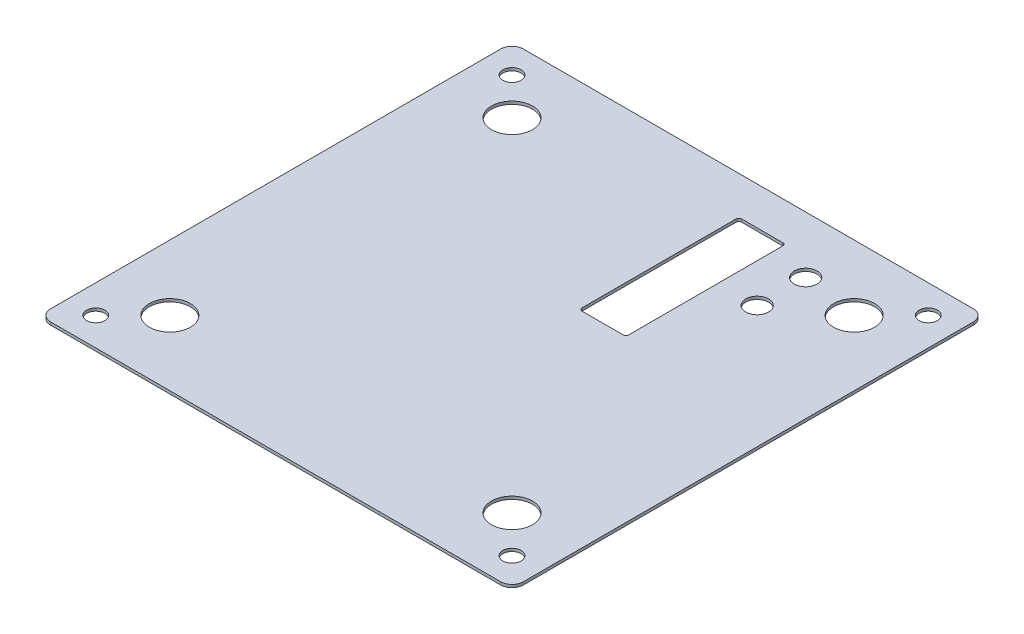
ISO-10303-21;
HEADER;
FILE_DESCRIPTION(('STEP AP214'),'2;1');
FILE_NAME('part.step','',(''),(''),'','','');
FILE_SCHEMA(('AUTOMOTIVE_DESIGN { 1 0 10303 214 1 1 1 1 }'));
ENDSEC;
DATA;
#1=APPLICATION_CONTEXT('core data for automotive mechanical design processes');
#2=APPLICATION_PROTOCOL_DEFINITION('international standard','automotive_design',2000,#1);
#3=PRODUCT_CONTEXT('',#1,'mechanical');
#4=PRODUCT('Part','Part','',(#3));
#5=PRODUCT_RELATED_PRODUCT_CATEGORY('part','',(#4));
#6=PRODUCT_DEFINITION_FORMATION('','',#4);
#7=PRODUCT_DEFINITION_CONTEXT('part definition',#1,'design');
#8=PRODUCT_DEFINITION('design','',#6,#7);
#9=PRODUCT_DEFINITION_SHAPE('','',#8);
#10=(LENGTH_UNIT() NAMED_UNIT(*) SI_UNIT(.MILLI.,.METRE.));
#11=(NAMED_UNIT(*) PLANE_ANGLE_UNIT() SI_UNIT($,.RADIAN.));
#12=(NAMED_UNIT(*) SI_UNIT($,.STERADIAN.) SOLID_ANGLE_UNIT());
#13=UNCERTAINTY_MEASURE_WITH_UNIT(LENGTH_MEASURE(1.E-05),#10,'distance_accuracy_value','');
#14=(GEOMETRIC_REPRESENTATION_CONTEXT(3) GLOBAL_UNCERTAINTY_ASSIGNED_CONTEXT((#13)) GLOBAL_UNIT_ASSIGNED_CONTEXT((#10,
#11,#12)) REPRESENTATION_CONTEXT('',''));
#15=CARTESIAN_POINT('',(0.,0.,0.));
#16=DIRECTION('',(0.,0.,1.));
#17=DIRECTION('',(1.,0.,0.));
#18=AXIS2_PLACEMENT_3D('',#15,#16,#17);
#19=CARTESIAN_POINT('',(41.45,0.5,41.45));
#20=DIRECTION('',(-1.,0.,0.));
#21=DIRECTION('',(0.,0.,1.));
#22=AXIS2_PLACEMENT_3D('',#19,#20,#21);
#23=PLANE('',#22);
#24=DIRECTION('',(0.,0.,-1.));
#25=VECTOR('',#24,1.);
#26=CARTESIAN_POINT('',(41.45,0.,41.45));
#27=LINE('',#26,#25);
#28=CARTESIAN_POINT('',(41.45,0.,39.45));
#29=VERTEX_POINT('',#28);
#30=CARTESIAN_POINT('',(41.45,0.,-39.45));
#31=VERTEX_POINT('',#30);
#32=EDGE_CURVE('E180',#29,#31,#27,.T.);
#33=ORIENTED_EDGE('',*,*,#32,.T.);
#34=DIRECTION('',(0.,-1.,0.));
#35=VECTOR('',#34,1.);
#36=CARTESIAN_POINT('',(41.45,0.5,-39.45));
#37=LINE('',#36,#35);
#38=CARTESIAN_POINT('',(41.45,0.5,-39.45));
#39=VERTEX_POINT('',#38);
#40=EDGE_CURVE('E204',#31,#39,#37,.F.);
#41=ORIENTED_EDGE('',*,*,#40,.T.);
#42=DIRECTION('',(0.,0.,-1.));
#43=VECTOR('',#42,1.);
#44=CARTESIAN_POINT('',(41.45,0.5,41.45));
#45=LINE('',#44,#43);
#46=CARTESIAN_POINT('',(41.45,0.5,39.45));
#47=VERTEX_POINT('',#46);
#48=EDGE_CURVE('E178',#47,#39,#45,.T.);
#49=ORIENTED_EDGE('',*,*,#48,.F.);
#50=DIRECTION('',(0.,-1.,0.));
#51=VECTOR('',#50,1.);
#52=CARTESIAN_POINT('',(41.45,0.5,39.45));
#53=LINE('',#52,#51);
#54=EDGE_CURVE('E201',#47,#29,#53,.T.);
#55=ORIENTED_EDGE('',*,*,#54,.T.);
#56=EDGE_LOOP('',(#33,#41,#49,#55));
#57=FACE_BOUND('',#56,.T.);
#58=ADVANCED_FACE('F35',(#57),#23,.F.);
#59=CARTESIAN_POINT('',(-41.45,0.5,-41.45));
#60=DIRECTION('',(0.,0.,1.));
#61=DIRECTION('',(1.,0.,0.));
#62=AXIS2_PLACEMENT_3D('',#59,#60,#61);
#63=PLANE('',#62);
#64=DIRECTION('',(-1.,0.,0.));
#65=VECTOR('',#64,1.);
#66=CARTESIAN_POINT('',(-41.45,0.,-41.45));
#67=LINE('',#66,#65);
#68=CARTESIAN_POINT('',(39.45,0.,-41.45));
#69=VERTEX_POINT('',#68);
#70=CARTESIAN_POINT('',(-39.45,0.,-41.45));
#71=VERTEX_POINT('',#70);
#72=EDGE_CURVE('E175',#69,#71,#67,.T.);
#73=ORIENTED_EDGE('',*,*,#72,.T.);
#74=DIRECTION('',(0.,-1.,0.));
#75=VECTOR('',#74,1.);
#76=CARTESIAN_POINT('',(-39.45,0.5,-41.45));
#77=LINE('',#76,#75);
#78=CARTESIAN_POINT('',(-39.45,0.5,-41.45));
#79=VERTEX_POINT('',#78);
#80=EDGE_CURVE('E153',#71,#79,#77,.F.);
#81=ORIENTED_EDGE('',*,*,#80,.T.);
#82=DIRECTION('',(-1.,0.,0.));
#83=VECTOR('',#82,1.);
#84=CARTESIAN_POINT('',(-41.45,0.5,-41.45));
#85=LINE('',#84,#83);
#86=CARTESIAN_POINT('',(39.45,0.5,-41.45));
#87=VERTEX_POINT('',#86);
#88=EDGE_CURVE('E395',#87,#79,#85,.T.);
#89=ORIENTED_EDGE('',*,*,#88,.F.);
#90=DIRECTION('',(0.,-1.,0.));
#91=VECTOR('',#90,1.);
#92=CARTESIAN_POINT('',(39.45,0.5,-41.45));
#93=LINE('',#92,#91);
#94=EDGE_CURVE('E158',#87,#69,#93,.T.);
#95=ORIENTED_EDGE('',*,*,#94,.T.);
#96=EDGE_LOOP('',(#73,#81,#89,#95));
#97=FACE_BOUND('',#96,.T.);
#98=ADVANCED_FACE('F298',(#97),#63,.F.);
#99=CARTESIAN_POINT('',(-41.45,0.5,41.45));
#100=DIRECTION('',(1.,0.,0.));
#101=DIRECTION('',(0.,0.,-1.));
#102=AXIS2_PLACEMENT_3D('',#99,#100,#101);
#103=PLANE('',#102);
#104=DIRECTION('',(0.,0.,1.));
#105=VECTOR('',#104,1.);
#106=CARTESIAN_POINT('',(-41.45,0.5,41.45));
#107=LINE('',#106,#105);
#108=CARTESIAN_POINT('',(-41.45,0.5,-39.45));
#109=VERTEX_POINT('',#108);
#110=CARTESIAN_POINT('',(-41.45,0.5,39.45));
#111=VERTEX_POINT('',#110);
#112=EDGE_CURVE('E168',#109,#111,#107,.T.);
#113=ORIENTED_EDGE('',*,*,#112,.F.);
#114=DIRECTION('',(0.,-1.,0.));
#115=VECTOR('',#114,1.);
#116=CARTESIAN_POINT('',(-41.45,0.5,-39.45));
#117=LINE('',#116,#115);
#118=CARTESIAN_POINT('',(-41.45,0.,-39.45));
#119=VERTEX_POINT('',#118);
#120=EDGE_CURVE('E152',#109,#119,#117,.T.);
#121=ORIENTED_EDGE('',*,*,#120,.T.);
#122=DIRECTION('',(0.,0.,1.));
#123=VECTOR('',#122,1.);
#124=CARTESIAN_POINT('',(-41.45,0.,41.45));
#125=LINE('',#124,#123);
#126=CARTESIAN_POINT('',(-41.45,0.,39.45));
#127=VERTEX_POINT('',#126);
#128=EDGE_CURVE('E165',#119,#127,#125,.T.);
#129=ORIENTED_EDGE('',*,*,#128,.T.);
#130=DIRECTION('',(0.,-1.,0.));
#131=VECTOR('',#130,1.);
#132=CARTESIAN_POINT('',(-41.45,0.5,39.45));
#133=LINE('',#132,#131);
#134=EDGE_CURVE('E170',#127,#111,#133,.F.);
#135=ORIENTED_EDGE('',*,*,#134,.T.);
#136=EDGE_LOOP('',(#113,#121,#129,#135));
#137=FACE_BOUND('',#136,.T.);
#138=ADVANCED_FACE('F164',(#137),#103,.F.);
#139=CARTESIAN_POINT('',(-41.45,0.5,41.45));
#140=DIRECTION('',(0.,0.,-1.));
#141=DIRECTION('',(-1.,0.,0.));
#142=AXIS2_PLACEMENT_3D('',#139,#140,#141);
#143=PLANE('',#142);
#144=DIRECTION('',(1.,0.,0.));
#145=VECTOR('',#144,1.);
#146=CARTESIAN_POINT('',(-41.45,0.,41.45));
#147=LINE('',#146,#145);
#148=CARTESIAN_POINT('',(-39.45,0.,41.45));
#149=VERTEX_POINT('',#148);
#150=CARTESIAN_POINT('',(39.45,0.,41.45));
#151=VERTEX_POINT('',#150);
#152=EDGE_CURVE('E174',#149,#151,#147,.T.);
#153=ORIENTED_EDGE('',*,*,#152,.T.);
#154=DIRECTION('',(0.,-1.,0.));
#155=VECTOR('',#154,1.);
#156=CARTESIAN_POINT('',(39.45,0.5,41.45));
#157=LINE('',#156,#155);
#158=CARTESIAN_POINT('',(39.45,0.5,41.45));
#159=VERTEX_POINT('',#158);
#160=EDGE_CURVE('E209',#151,#159,#157,.F.);
#161=ORIENTED_EDGE('',*,*,#160,.T.);
#162=DIRECTION('',(1.,0.,0.));
#163=VECTOR('',#162,1.);
#164=CARTESIAN_POINT('',(-41.45,0.5,41.45));
#165=LINE('',#164,#163);
#166=CARTESIAN_POINT('',(-39.45,0.5,41.45));
#167=VERTEX_POINT('',#166);
#168=EDGE_CURVE('E184',#167,#159,#165,.T.);
#169=ORIENTED_EDGE('',*,*,#168,.F.);
#170=DIRECTION('',(0.,-1.,0.));
#171=VECTOR('',#170,1.);
#172=CARTESIAN_POINT('',(-39.45,0.5,41.45));
#173=LINE('',#172,#171);
#174=EDGE_CURVE('E206',#167,#149,#173,.T.);
#175=ORIENTED_EDGE('',*,*,#174,.T.);
#176=EDGE_LOOP('',(#153,#161,#169,#175));
#177=FACE_BOUND('',#176,.T.);
#178=ADVANCED_FACE('F412',(#177),#143,.F.);
#179=CARTESIAN_POINT('',(0.,0.5,0.));
#180=DIRECTION('',(0.,-1.,0.));
#181=DIRECTION('',(0.,0.,-1.));
#182=AXIS2_PLACEMENT_3D('',#179,#180,#181);
#183=PLANE('',#182);
#184=DIRECTION('',(-1.,0.,0.));
#185=VECTOR('',#184,1.);
#186=CARTESIAN_POINT('',(4.99999852000002,0.5,-34.7799998));
#187=LINE('',#186,#185);
#188=CARTESIAN_POINT('',(12.69999852,0.5,-34.7799998));
#189=VERTEX_POINT('',#188);
#190=CARTESIAN_POINT('',(5.49999852000002,0.5,-34.7799998));
#191=VERTEX_POINT('',#190);
#192=EDGE_CURVE('E350',#189,#191,#187,.T.);
#193=ORIENTED_EDGE('',*,*,#192,.F.);
#194=CARTESIAN_POINT('',(12.69999852,0.5,-34.2799998));
#195=DIRECTION('',(0.,-1.,0.));
#196=DIRECTION('',(0.,0.,-1.));
#197=AXIS2_PLACEMENT_3D('',#194,#195,#196);
#198=CIRCLE('',#197,0.5);
#199=CARTESIAN_POINT('',(13.19999852,0.5,-34.2799998));
#200=VERTEX_POINT('',#199);
#201=EDGE_CURVE('E57',#189,#200,#198,.T.);
#202=ORIENTED_EDGE('',*,*,#201,.T.);
#203=DIRECTION('',(0.,0.,-1.));
#204=VECTOR('',#203,1.);
#205=CARTESIAN_POINT('',(13.19999852,0.5,-6.7799998));
#206=LINE('',#205,#204);
#207=CARTESIAN_POINT('',(13.19999852,0.5,-7.2799998));
#208=VERTEX_POINT('',#207);
#209=EDGE_CURVE('E349',#208,#200,#206,.T.);
#210=ORIENTED_EDGE('',*,*,#209,.F.);
#211=CARTESIAN_POINT('',(12.69999852,0.5,-7.2799998));
#212=DIRECTION('',(0.,-1.,0.));
#213=DIRECTION('',(0.,0.,-1.));
#214=AXIS2_PLACEMENT_3D('',#211,#212,#213);
#215=CIRCLE('',#214,0.5);
#216=CARTESIAN_POINT('',(12.69999852,0.5,-6.7799998));
#217=VERTEX_POINT('',#216);
#218=EDGE_CURVE('E271',#208,#217,#215,.T.);
#219=ORIENTED_EDGE('',*,*,#218,.T.);
#220=DIRECTION('',(1.,0.,0.));
#221=VECTOR('',#220,1.);
#222=CARTESIAN_POINT('',(4.99999852000002,0.5,-6.7799998));
#223=LINE('',#222,#221);
#224=CARTESIAN_POINT('',(5.49999852000002,0.5,-6.7799998));
#225=VERTEX_POINT('',#224);
#226=EDGE_CURVE('E343',#225,#217,#223,.T.);
#227=ORIENTED_EDGE('',*,*,#226,.F.);
#228=CARTESIAN_POINT('',(5.49999852000002,0.5,-7.2799998));
#229=DIRECTION('',(0.,-1.,0.));
#230=DIRECTION('',(0.,0.,-1.));
#231=AXIS2_PLACEMENT_3D('',#228,#229,#230);
#232=CIRCLE('',#231,0.5);
#233=CARTESIAN_POINT('',(4.99999852000002,0.5,-7.2799998));
#234=VERTEX_POINT('',#233);
#235=EDGE_CURVE('E267',#225,#234,#232,.T.);
#236=ORIENTED_EDGE('',*,*,#235,.T.);
#237=DIRECTION('',(0.,0.,1.));
#238=VECTOR('',#237,1.);
#239=CARTESIAN_POINT('',(4.99999852000002,0.5,-6.7799998));
#240=LINE('',#239,#238);
#241=CARTESIAN_POINT('',(4.99999852000002,0.5,-34.2799998));
#242=VERTEX_POINT('',#241);
#243=EDGE_CURVE('E352',#242,#234,#240,.T.);
#244=ORIENTED_EDGE('',*,*,#243,.F.);
#245=CARTESIAN_POINT('',(5.49999852000002,0.5,-34.2799998));
#246=DIRECTION('',(0.,-1.,0.));
#247=DIRECTION('',(0.,0.,-1.));
#248=AXIS2_PLACEMENT_3D('',#245,#246,#247);
#249=CIRCLE('',#248,0.5);
#250=EDGE_CURVE('E43',#242,#191,#249,.T.);
#251=ORIENTED_EDGE('',*,*,#250,.T.);
#252=EDGE_LOOP('',(#193,#202,#210,#219,#227,#236,#244,#251));
#253=FACE_BOUND('',#252,.T.);
#254=CARTESIAN_POINT('',(19.99999956709,0.5,-22.999799473955));
#255=DIRECTION('',(0.,1.,0.));
#256=DIRECTION('',(0.,0.,1.));
#257=AXIS2_PLACEMENT_3D('',#254,#255,#256);
#258=CIRCLE('',#257,2.);
#259=CARTESIAN_POINT('',(19.99999956709,0.5,-20.999799473955));
#260=VERTEX_POINT('',#259);
#261=EDGE_CURVE('E236',#260,#260,#258,.T.);
#262=ORIENTED_EDGE('',*,*,#261,.F.);
#263=EDGE_LOOP('',(#262));
#264=FACE_BOUND('',#263,.T.);
#265=CARTESIAN_POINT('',(19.99999956709,0.5,-31.499795659258));
#266=DIRECTION('',(0.,1.,0.));
#267=DIRECTION('',(0.,0.,1.));
#268=AXIS2_PLACEMENT_3D('',#265,#266,#267);
#269=CIRCLE('',#268,2.);
#270=CARTESIAN_POINT('',(19.99999956709,0.5,-29.499795659258));
#271=VERTEX_POINT('',#270);
#272=EDGE_CURVE('E232',#271,#271,#269,.T.);
#273=ORIENTED_EDGE('',*,*,#272,.F.);
#274=EDGE_LOOP('',(#273));
#275=FACE_BOUND('',#274,.T.);
#276=CARTESIAN_POINT('',(-36.5,0.5,36.5));
#277=DIRECTION('',(0.,1.,0.));
#278=DIRECTION('',(0.,0.,1.));
#279=AXIS2_PLACEMENT_3D('',#276,#277,#278);
#280=CIRCLE('',#279,1.6);
#281=CARTESIAN_POINT('',(-36.5,0.5,38.1));
#282=VERTEX_POINT('',#281);
#283=EDGE_CURVE('E228',#282,#282,#280,.T.);
#284=ORIENTED_EDGE('',*,*,#283,.F.);
#285=EDGE_LOOP('',(#284));
#286=FACE_BOUND('',#285,.T.);
#287=CARTESIAN_POINT('',(36.5,0.5,36.5));
#288=DIRECTION('',(0.,1.,0.));
#289=DIRECTION('',(0.,0.,1.));
#290=AXIS2_PLACEMENT_3D('',#287,#288,#289);
#291=CIRCLE('',#290,1.6);
#292=CARTESIAN_POINT('',(36.5,0.5,38.1));
#293=VERTEX_POINT('',#292);
#294=EDGE_CURVE('E224',#293,#293,#291,.T.);
#295=ORIENTED_EDGE('',*,*,#294,.F.);
#296=EDGE_LOOP('',(#295));
#297=FACE_BOUND('',#296,.T.);
#298=CARTESIAN_POINT('',(36.5,0.5,-36.5));
#299=DIRECTION('',(0.,1.,0.));
#300=DIRECTION('',(0.,0.,1.));
#301=AXIS2_PLACEMENT_3D('',#298,#299,#300);
#302=CIRCLE('',#301,1.6);
#303=CARTESIAN_POINT('',(36.5,0.5,-34.9));
#304=VERTEX_POINT('',#303);
#305=EDGE_CURVE('E220',#304,#304,#302,.T.);
#306=ORIENTED_EDGE('',*,*,#305,.F.);
#307=EDGE_LOOP('',(#306));
#308=FACE_BOUND('',#307,.T.);
#309=CARTESIAN_POINT('',(-36.5,0.5,-36.5));
#310=DIRECTION('',(0.,1.,0.));
#311=DIRECTION('',(0.,0.,1.));
#312=AXIS2_PLACEMENT_3D('',#309,#310,#311);
#313=CIRCLE('',#312,1.6);
#314=CARTESIAN_POINT('',(-36.5,0.5,-34.9));
#315=VERTEX_POINT('',#314);
#316=EDGE_CURVE('E216',#315,#315,#313,.T.);
#317=ORIENTED_EDGE('',*,*,#316,.F.);
#318=EDGE_LOOP('',(#317));
#319=FACE_BOUND('',#318,.T.);
#320=CARTESIAN_POINT('',(-30.,0.5,30.));
#321=DIRECTION('',(0.,1.,0.));
#322=DIRECTION('',(0.,0.,1.));
#323=AXIS2_PLACEMENT_3D('',#320,#321,#322);
#324=CIRCLE('',#323,3.6);
#325=CARTESIAN_POINT('',(-30.,0.5,33.6));
#326=VERTEX_POINT('',#325);
#327=EDGE_CURVE('E215',#326,#326,#324,.T.);
#328=ORIENTED_EDGE('',*,*,#327,.F.);
#329=EDGE_LOOP('',(#328));
#330=FACE_BOUND('',#329,.T.);
#331=CARTESIAN_POINT('',(30.,0.5,30.));
#332=DIRECTION('',(0.,1.,0.));
#333=DIRECTION('',(0.,0.,1.));
#334=AXIS2_PLACEMENT_3D('',#331,#332,#333);
#335=CIRCLE('',#334,3.6);
#336=CARTESIAN_POINT('',(30.,0.5,33.6));
#337=VERTEX_POINT('',#336);
#338=EDGE_CURVE('E373',#337,#337,#335,.T.);
#339=ORIENTED_EDGE('',*,*,#338,.F.);
#340=EDGE_LOOP('',(#339));
#341=FACE_BOUND('',#340,.T.);
#342=CARTESIAN_POINT('',(30.,0.5,-30.));
#343=DIRECTION('',(0.,1.,0.));
#344=DIRECTION('',(0.,0.,1.));
#345=AXIS2_PLACEMENT_3D('',#342,#343,#344);
#346=CIRCLE('',#345,3.6);
#347=CARTESIAN_POINT('',(30.,0.5,-26.4));
#348=VERTEX_POINT('',#347);
#349=EDGE_CURVE('E379',#348,#348,#346,.T.);
#350=ORIENTED_EDGE('',*,*,#349,.F.);
#351=EDGE_LOOP('',(#350));
#352=FACE_BOUND('',#351,.T.);
#353=CARTESIAN_POINT('',(-30.,0.5,-30.));
#354=DIRECTION('',(0.,1.,0.));
#355=DIRECTION('',(0.,0.,1.));
#356=AXIS2_PLACEMENT_3D('',#353,#354,#355);
#357=CIRCLE('',#356,3.6);
#358=CARTESIAN_POINT('',(-30.,0.5,-26.4));
#359=VERTEX_POINT('',#358);
#360=EDGE_CURVE('E385',#359,#359,#357,.T.);
#361=ORIENTED_EDGE('',*,*,#360,.F.);
#362=EDGE_LOOP('',(#361));
#363=FACE_BOUND('',#362,.T.);
#364=ORIENTED_EDGE('',*,*,#88,.T.);
#365=CARTESIAN_POINT('',(-39.45,0.5,-39.45));
#366=DIRECTION('',(0.,-1.,0.));
#367=DIRECTION('',(0.,0.,-1.));
#368=AXIS2_PLACEMENT_3D('',#365,#366,#367);
#369=CIRCLE('',#368,2.);
#370=EDGE_CURVE('E199',#79,#109,#369,.F.);
#371=ORIENTED_EDGE('',*,*,#370,.T.);
#372=ORIENTED_EDGE('',*,*,#112,.T.);
#373=CARTESIAN_POINT('',(-39.45,0.5,39.45));
#374=DIRECTION('',(0.,-1.,0.));
#375=DIRECTION('',(0.,0.,-1.));
#376=AXIS2_PLACEMENT_3D('',#373,#374,#375);
#377=CIRCLE('',#376,2.);
#378=EDGE_CURVE('E193',#111,#167,#377,.F.);
#379=ORIENTED_EDGE('',*,*,#378,.T.);
#380=ORIENTED_EDGE('',*,*,#168,.T.);
#381=CARTESIAN_POINT('',(39.45,0.5,39.45));
#382=DIRECTION('',(0.,-1.,0.));
#383=DIRECTION('',(0.,0.,-1.));
#384=AXIS2_PLACEMENT_3D('',#381,#382,#383);
#385=CIRCLE('',#384,2.);
#386=EDGE_CURVE('E195',#159,#47,#385,.F.);
#387=ORIENTED_EDGE('',*,*,#386,.T.);
#388=ORIENTED_EDGE('',*,*,#48,.T.);
#389=CARTESIAN_POINT('',(39.45,0.5,-39.45));
#390=DIRECTION('',(0.,-1.,0.));
#391=DIRECTION('',(0.,0.,-1.));
#392=AXIS2_PLACEMENT_3D('',#389,#390,#391);
#393=CIRCLE('',#392,2.);
#394=EDGE_CURVE('E197',#39,#87,#393,.F.);
#395=ORIENTED_EDGE('',*,*,#394,.T.);
#396=EDGE_LOOP('',(#364,#371,#372,#379,#380,#387,#388,#395));
#397=FACE_BOUND('',#396,.T.);
#398=ADVANCED_FACE('F408',(#253,#264,#275,#286,#297,#308,#319,#330,#341,#352,#363,#397),#183,.F.);
#399=CARTESIAN_POINT('',(0.,0.,0.));
#400=DIRECTION('',(0.,-1.,0.));
#401=DIRECTION('',(0.,0.,-1.));
#402=AXIS2_PLACEMENT_3D('',#399,#400,#401);
#403=PLANE('',#402);
#404=DIRECTION('',(0.,0.,1.));
#405=VECTOR('',#404,1.);
#406=CARTESIAN_POINT('',(13.19999852,0.,0.));
#407=LINE('',#406,#405);
#408=CARTESIAN_POINT('',(13.19999852,0.,-34.2799998));
#409=VERTEX_POINT('',#408);
#410=CARTESIAN_POINT('',(13.19999852,0.,-7.2799998));
#411=VERTEX_POINT('',#410);
#412=EDGE_CURVE('E245',#409,#411,#407,.T.);
#413=ORIENTED_EDGE('',*,*,#412,.F.);
#414=CARTESIAN_POINT('',(12.69999852,0.,-34.2799998));
#415=DIRECTION('',(0.,-1.,0.));
#416=DIRECTION('',(0.,0.,-1.));
#417=AXIS2_PLACEMENT_3D('',#414,#415,#416);
#418=CIRCLE('',#417,0.5);
#419=CARTESIAN_POINT('',(12.69999852,0.,-34.7799998));
#420=VERTEX_POINT('',#419);
#421=EDGE_CURVE('E276',#409,#420,#418,.F.);
#422=ORIENTED_EDGE('',*,*,#421,.T.);
#423=DIRECTION('',(1.,0.,0.));
#424=VECTOR('',#423,1.);
#425=CARTESIAN_POINT('',(0.,0.,-34.7799998));
#426=LINE('',#425,#424);
#427=CARTESIAN_POINT('',(5.49999852000002,0.,-34.7799998));
#428=VERTEX_POINT('',#427);
#429=EDGE_CURVE('E211',#428,#420,#426,.T.);
#430=ORIENTED_EDGE('',*,*,#429,.F.);
#431=CARTESIAN_POINT('',(5.49999852000002,0.,-34.2799998));
#432=DIRECTION('',(0.,-1.,0.));
#433=DIRECTION('',(0.,0.,-1.));
#434=AXIS2_PLACEMENT_3D('',#431,#432,#433);
#435=CIRCLE('',#434,0.5);
#436=CARTESIAN_POINT('',(4.99999852000002,0.,-34.2799998));
#437=VERTEX_POINT('',#436);
#438=EDGE_CURVE('E11',#428,#437,#435,.F.);
#439=ORIENTED_EDGE('',*,*,#438,.T.);
#440=DIRECTION('',(0.,0.,-1.));
#441=VECTOR('',#440,1.);
#442=CARTESIAN_POINT('',(4.99999852000002,0.,0.));
#443=LINE('',#442,#441);
#444=CARTESIAN_POINT('',(4.99999852000002,0.,-7.2799998));
#445=VERTEX_POINT('',#444);
#446=EDGE_CURVE('E239',#445,#437,#443,.T.);
#447=ORIENTED_EDGE('',*,*,#446,.F.);
#448=CARTESIAN_POINT('',(5.49999852000002,0.,-7.2799998));
#449=DIRECTION('',(0.,-1.,0.));
#450=DIRECTION('',(0.,0.,-1.));
#451=AXIS2_PLACEMENT_3D('',#448,#449,#450);
#452=CIRCLE('',#451,0.5);
#453=CARTESIAN_POINT('',(5.49999852000002,0.,-6.7799998));
#454=VERTEX_POINT('',#453);
#455=EDGE_CURVE('E269',#445,#454,#452,.F.);
#456=ORIENTED_EDGE('',*,*,#455,.T.);
#457=DIRECTION('',(-1.,0.,0.));
#458=VECTOR('',#457,1.);
#459=CARTESIAN_POINT('',(0.,0.,-6.7799998));
#460=LINE('',#459,#458);
#461=CARTESIAN_POINT('',(12.69999852,0.,-6.7799998));
#462=VERTEX_POINT('',#461);
#463=EDGE_CURVE('E242',#462,#454,#460,.T.);
#464=ORIENTED_EDGE('',*,*,#463,.F.);
#465=CARTESIAN_POINT('',(12.69999852,0.,-7.2799998));
#466=DIRECTION('',(0.,-1.,0.));
#467=DIRECTION('',(0.,0.,-1.));
#468=AXIS2_PLACEMENT_3D('',#465,#466,#467);
#469=CIRCLE('',#468,0.5);
#470=EDGE_CURVE('E273',#462,#411,#469,.F.);
#471=ORIENTED_EDGE('',*,*,#470,.T.);
#472=EDGE_LOOP('',(#413,#422,#430,#439,#447,#456,#464,#471));
#473=FACE_BOUND('',#472,.T.);
#474=CARTESIAN_POINT('',(19.99999956709,0.,-22.999799473955));
#475=DIRECTION('',(0.,-1.,0.));
#476=DIRECTION('',(0.,0.,-1.));
#477=AXIS2_PLACEMENT_3D('',#474,#475,#476);
#478=CIRCLE('',#477,2.);
#479=CARTESIAN_POINT('',(19.99999956709,0.,-24.999799473955));
#480=VERTEX_POINT('',#479);
#481=EDGE_CURVE('E233',#480,#480,#478,.T.);
#482=ORIENTED_EDGE('',*,*,#481,.F.);
#483=EDGE_LOOP('',(#482));
#484=FACE_BOUND('',#483,.T.);
#485=CARTESIAN_POINT('',(19.99999956709,0.,-31.499795659258));
#486=DIRECTION('',(0.,-1.,0.));
#487=DIRECTION('',(0.,0.,-1.));
#488=AXIS2_PLACEMENT_3D('',#485,#486,#487);
#489=CIRCLE('',#488,2.);
#490=CARTESIAN_POINT('',(19.99999956709,0.,-33.499795659258));
#491=VERTEX_POINT('',#490);
#492=EDGE_CURVE('E229',#491,#491,#489,.T.);
#493=ORIENTED_EDGE('',*,*,#492,.F.);
#494=EDGE_LOOP('',(#493));
#495=FACE_BOUND('',#494,.T.);
#496=CARTESIAN_POINT('',(-36.5,0.,36.5));
#497=DIRECTION('',(0.,-1.,0.));
#498=DIRECTION('',(0.,0.,-1.));
#499=AXIS2_PLACEMENT_3D('',#496,#497,#498);
#500=CIRCLE('',#499,1.6);
#501=CARTESIAN_POINT('',(-36.5,0.,34.9));
#502=VERTEX_POINT('',#501);
#503=EDGE_CURVE('E225',#502,#502,#500,.T.);
#504=ORIENTED_EDGE('',*,*,#503,.F.);
#505=EDGE_LOOP('',(#504));
#506=FACE_BOUND('',#505,.T.);
#507=CARTESIAN_POINT('',(36.5,0.,36.5));
#508=DIRECTION('',(0.,-1.,0.));
#509=DIRECTION('',(0.,0.,-1.));
#510=AXIS2_PLACEMENT_3D('',#507,#508,#509);
#511=CIRCLE('',#510,1.6);
#512=CARTESIAN_POINT('',(36.5,0.,34.9));
#513=VERTEX_POINT('',#512);
#514=EDGE_CURVE('E221',#513,#513,#511,.T.);
#515=ORIENTED_EDGE('',*,*,#514,.F.);
#516=EDGE_LOOP('',(#515));
#517=FACE_BOUND('',#516,.T.);
#518=CARTESIAN_POINT('',(36.5,0.,-36.5));
#519=DIRECTION('',(0.,-1.,0.));
#520=DIRECTION('',(0.,0.,-1.));
#521=AXIS2_PLACEMENT_3D('',#518,#519,#520);
#522=CIRCLE('',#521,1.6);
#523=CARTESIAN_POINT('',(36.5,0.,-38.1));
#524=VERTEX_POINT('',#523);
#525=EDGE_CURVE('E217',#524,#524,#522,.T.);
#526=ORIENTED_EDGE('',*,*,#525,.F.);
#527=EDGE_LOOP('',(#526));
#528=FACE_BOUND('',#527,.T.);
#529=CARTESIAN_POINT('',(-36.5,0.,-36.5));
#530=DIRECTION('',(0.,-1.,0.));
#531=DIRECTION('',(0.,0.,-1.));
#532=AXIS2_PLACEMENT_3D('',#529,#530,#531);
#533=CIRCLE('',#532,1.6);
#534=CARTESIAN_POINT('',(-36.5,0.,-38.1));
#535=VERTEX_POINT('',#534);
#536=EDGE_CURVE('E212',#535,#535,#533,.T.);
#537=ORIENTED_EDGE('',*,*,#536,.F.);
#538=EDGE_LOOP('',(#537));
#539=FACE_BOUND('',#538,.T.);
#540=CARTESIAN_POINT('',(-30.,0.,30.));
#541=DIRECTION('',(0.,1.,0.));
#542=DIRECTION('',(0.,0.,1.));
#543=AXIS2_PLACEMENT_3D('',#540,#541,#542);
#544=CIRCLE('',#543,3.6);
#545=CARTESIAN_POINT('',(-30.,0.,33.6));
#546=VERTEX_POINT('',#545);
#547=EDGE_CURVE('E370',#546,#546,#544,.T.);
#548=ORIENTED_EDGE('',*,*,#547,.T.);
#549=EDGE_LOOP('',(#548));
#550=FACE_BOUND('',#549,.T.);
#551=CARTESIAN_POINT('',(30.,0.,30.));
#552=DIRECTION('',(0.,1.,0.));
#553=DIRECTION('',(0.,0.,1.));
#554=AXIS2_PLACEMENT_3D('',#551,#552,#553);
#555=CIRCLE('',#554,3.6);
#556=CARTESIAN_POINT('',(30.,0.,33.6));
#557=VERTEX_POINT('',#556);
#558=EDGE_CURVE('E376',#557,#557,#555,.T.);
#559=ORIENTED_EDGE('',*,*,#558,.T.);
#560=EDGE_LOOP('',(#559));
#561=FACE_BOUND('',#560,.T.);
#562=CARTESIAN_POINT('',(30.,0.,-30.));
#563=DIRECTION('',(0.,1.,0.));
#564=DIRECTION('',(0.,0.,1.));
#565=AXIS2_PLACEMENT_3D('',#562,#563,#564);
#566=CIRCLE('',#565,3.6);
#567=CARTESIAN_POINT('',(30.,0.,-26.4));
#568=VERTEX_POINT('',#567);
#569=EDGE_CURVE('E382',#568,#568,#566,.T.);
#570=ORIENTED_EDGE('',*,*,#569,.T.);
#571=EDGE_LOOP('',(#570));
#572=FACE_BOUND('',#571,.T.);
#573=CARTESIAN_POINT('',(-30.,0.,-30.));
#574=DIRECTION('',(0.,1.,0.));
#575=DIRECTION('',(0.,0.,1.));
#576=AXIS2_PLACEMENT_3D('',#573,#574,#575);
#577=CIRCLE('',#576,3.6);
#578=CARTESIAN_POINT('',(-30.,0.,-26.4));
#579=VERTEX_POINT('',#578);
#580=EDGE_CURVE('E388',#579,#579,#577,.T.);
#581=ORIENTED_EDGE('',*,*,#580,.T.);
#582=EDGE_LOOP('',(#581));
#583=FACE_BOUND('',#582,.T.);
#584=ORIENTED_EDGE('',*,*,#128,.F.);
#585=CARTESIAN_POINT('',(-39.45,0.,-39.45));
#586=DIRECTION('',(0.,-1.,0.));
#587=DIRECTION('',(0.,0.,-1.));
#588=AXIS2_PLACEMENT_3D('',#585,#586,#587);
#589=CIRCLE('',#588,2.);
#590=EDGE_CURVE('E148',#119,#71,#589,.T.);
#591=ORIENTED_EDGE('',*,*,#590,.T.);
#592=ORIENTED_EDGE('',*,*,#72,.F.);
#593=CARTESIAN_POINT('',(39.45,0.,-39.45));
#594=DIRECTION('',(0.,-1.,0.));
#595=DIRECTION('',(0.,0.,-1.));
#596=AXIS2_PLACEMENT_3D('',#593,#594,#595);
#597=CIRCLE('',#596,2.);
#598=EDGE_CURVE('E159',#69,#31,#597,.T.);
#599=ORIENTED_EDGE('',*,*,#598,.T.);
#600=ORIENTED_EDGE('',*,*,#32,.F.);
#601=CARTESIAN_POINT('',(39.45,0.,39.45));
#602=DIRECTION('',(0.,-1.,0.));
#603=DIRECTION('',(0.,0.,-1.));
#604=AXIS2_PLACEMENT_3D('',#601,#602,#603);
#605=CIRCLE('',#604,2.);
#606=EDGE_CURVE('E187',#29,#151,#605,.T.);
#607=ORIENTED_EDGE('',*,*,#606,.T.);
#608=ORIENTED_EDGE('',*,*,#152,.F.);
#609=CARTESIAN_POINT('',(-39.45,0.,39.45));
#610=DIRECTION('',(0.,-1.,0.));
#611=DIRECTION('',(0.,0.,-1.));
#612=AXIS2_PLACEMENT_3D('',#609,#610,#611);
#613=CIRCLE('',#612,2.);
#614=EDGE_CURVE('E169',#149,#127,#613,.T.);
#615=ORIENTED_EDGE('',*,*,#614,.T.);
#616=EDGE_LOOP('',(#584,#591,#592,#599,#600,#607,#608,#615));
#617=FACE_BOUND('',#616,.T.);
#618=ADVANCED_FACE('F172',(#473,#484,#495,#506,#517,#528,#539,#550,#561,#572,#583,#617),#403,.T.);
#619=CARTESIAN_POINT('',(-30.,0.,-30.));
#620=DIRECTION('',(0.,1.,0.));
#621=DIRECTION('',(0.,0.,1.));
#622=AXIS2_PLACEMENT_3D('',#619,#620,#621);
#623=CYLINDRICAL_SURFACE('',#622,3.6);
#624=ORIENTED_EDGE('',*,*,#580,.F.);
#625=EDGE_LOOP('',(#624));
#626=FACE_BOUND('',#625,.T.);
#627=ORIENTED_EDGE('',*,*,#360,.T.);
#628=EDGE_LOOP('',(#627));
#629=FACE_BOUND('',#628,.T.);
#630=ADVANCED_FACE('F425',(#626,#629),#623,.F.);
#631=CARTESIAN_POINT('',(30.,0.,-30.));
#632=DIRECTION('',(0.,1.,0.));
#633=DIRECTION('',(0.,0.,1.));
#634=AXIS2_PLACEMENT_3D('',#631,#632,#633);
#635=CYLINDRICAL_SURFACE('',#634,3.6);
#636=ORIENTED_EDGE('',*,*,#569,.F.);
#637=EDGE_LOOP('',(#636));
#638=FACE_BOUND('',#637,.T.);
#639=ORIENTED_EDGE('',*,*,#349,.T.);
#640=EDGE_LOOP('',(#639));
#641=FACE_BOUND('',#640,.T.);
#642=ADVANCED_FACE('F429',(#638,#641),#635,.F.);
#643=CARTESIAN_POINT('',(30.,0.,30.));
#644=DIRECTION('',(0.,1.,0.));
#645=DIRECTION('',(0.,0.,1.));
#646=AXIS2_PLACEMENT_3D('',#643,#644,#645);
#647=CYLINDRICAL_SURFACE('',#646,3.6);
#648=ORIENTED_EDGE('',*,*,#558,.F.);
#649=EDGE_LOOP('',(#648));
#650=FACE_BOUND('',#649,.T.);
#651=ORIENTED_EDGE('',*,*,#338,.T.);
#652=EDGE_LOOP('',(#651));
#653=FACE_BOUND('',#652,.T.);
#654=ADVANCED_FACE('F433',(#650,#653),#647,.F.);
#655=CARTESIAN_POINT('',(-30.,0.,30.));
#656=DIRECTION('',(0.,1.,0.));
#657=DIRECTION('',(0.,0.,1.));
#658=AXIS2_PLACEMENT_3D('',#655,#656,#657);
#659=CYLINDRICAL_SURFACE('',#658,3.6);
#660=ORIENTED_EDGE('',*,*,#547,.F.);
#661=EDGE_LOOP('',(#660));
#662=FACE_BOUND('',#661,.T.);
#663=ORIENTED_EDGE('',*,*,#327,.T.);
#664=EDGE_LOOP('',(#663));
#665=FACE_BOUND('',#664,.T.);
#666=ADVANCED_FACE('F312',(#662,#665),#659,.F.);
#667=CARTESIAN_POINT('',(-39.45,0.5,-39.45));
#668=DIRECTION('',(0.,-1.,0.));
#669=DIRECTION('',(0.,0.,-1.));
#670=AXIS2_PLACEMENT_3D('',#667,#668,#669);
#671=CYLINDRICAL_SURFACE('',#670,2.);
#672=ORIENTED_EDGE('',*,*,#370,.F.);
#673=ORIENTED_EDGE('',*,*,#80,.F.);
#674=ORIENTED_EDGE('',*,*,#590,.F.);
#675=ORIENTED_EDGE('',*,*,#120,.F.);
#676=EDGE_LOOP('',(#672,#673,#674,#675));
#677=FACE_BOUND('',#676,.T.);
#678=ADVANCED_FACE('F151',(#677),#671,.T.);
#679=CARTESIAN_POINT('',(39.45,0.5,-39.45));
#680=DIRECTION('',(0.,-1.,0.));
#681=DIRECTION('',(0.,0.,-1.));
#682=AXIS2_PLACEMENT_3D('',#679,#680,#681);
#683=CYLINDRICAL_SURFACE('',#682,2.);
#684=ORIENTED_EDGE('',*,*,#394,.F.);
#685=ORIENTED_EDGE('',*,*,#40,.F.);
#686=ORIENTED_EDGE('',*,*,#598,.F.);
#687=ORIENTED_EDGE('',*,*,#94,.F.);
#688=EDGE_LOOP('',(#684,#685,#686,#687));
#689=FACE_BOUND('',#688,.T.);
#690=ADVANCED_FACE('F311',(#689),#683,.T.);
#691=CARTESIAN_POINT('',(39.45,0.5,39.45));
#692=DIRECTION('',(0.,-1.,0.));
#693=DIRECTION('',(0.,0.,-1.));
#694=AXIS2_PLACEMENT_3D('',#691,#692,#693);
#695=CYLINDRICAL_SURFACE('',#694,2.);
#696=ORIENTED_EDGE('',*,*,#386,.F.);
#697=ORIENTED_EDGE('',*,*,#160,.F.);
#698=ORIENTED_EDGE('',*,*,#606,.F.);
#699=ORIENTED_EDGE('',*,*,#54,.F.);
#700=EDGE_LOOP('',(#696,#697,#698,#699));
#701=FACE_BOUND('',#700,.T.);
#702=ADVANCED_FACE('F315',(#701),#695,.T.);
#703=CARTESIAN_POINT('',(-39.45,0.5,39.45));
#704=DIRECTION('',(0.,-1.,0.));
#705=DIRECTION('',(0.,0.,-1.));
#706=AXIS2_PLACEMENT_3D('',#703,#704,#705);
#707=CYLINDRICAL_SURFACE('',#706,2.);
#708=ORIENTED_EDGE('',*,*,#378,.F.);
#709=ORIENTED_EDGE('',*,*,#134,.F.);
#710=ORIENTED_EDGE('',*,*,#614,.F.);
#711=ORIENTED_EDGE('',*,*,#174,.F.);
#712=EDGE_LOOP('',(#708,#709,#710,#711));
#713=FACE_BOUND('',#712,.T.);
#714=ADVANCED_FACE('F319',(#713),#707,.T.);
#715=CARTESIAN_POINT('',(-36.5,-9.5,-36.5));
#716=DIRECTION('',(0.,1.,0.));
#717=DIRECTION('',(0.,0.,1.));
#718=AXIS2_PLACEMENT_3D('',#715,#716,#717);
#719=CYLINDRICAL_SURFACE('',#718,1.6);
#720=ORIENTED_EDGE('',*,*,#536,.T.);
#721=EDGE_LOOP('',(#720));
#722=FACE_BOUND('',#721,.T.);
#723=ORIENTED_EDGE('',*,*,#316,.T.);
#724=EDGE_LOOP('',(#723));
#725=FACE_BOUND('',#724,.T.);
#726=ADVANCED_FACE('F323',(#722,#725),#719,.F.);
#727=CARTESIAN_POINT('',(36.5,-9.5,-36.5));
#728=DIRECTION('',(0.,1.,0.));
#729=DIRECTION('',(0.,0.,1.));
#730=AXIS2_PLACEMENT_3D('',#727,#728,#729);
#731=CYLINDRICAL_SURFACE('',#730,1.6);
#732=ORIENTED_EDGE('',*,*,#525,.T.);
#733=EDGE_LOOP('',(#732));
#734=FACE_BOUND('',#733,.T.);
#735=ORIENTED_EDGE('',*,*,#305,.T.);
#736=EDGE_LOOP('',(#735));
#737=FACE_BOUND('',#736,.T.);
#738=ADVANCED_FACE('F443',(#734,#737),#731,.F.);
#739=CARTESIAN_POINT('',(36.5,-9.5,36.5));
#740=DIRECTION('',(0.,1.,0.));
#741=DIRECTION('',(0.,0.,1.));
#742=AXIS2_PLACEMENT_3D('',#739,#740,#741);
#743=CYLINDRICAL_SURFACE('',#742,1.6);
#744=ORIENTED_EDGE('',*,*,#514,.T.);
#745=EDGE_LOOP('',(#744));
#746=FACE_BOUND('',#745,.T.);
#747=ORIENTED_EDGE('',*,*,#294,.T.);
#748=EDGE_LOOP('',(#747));
#749=FACE_BOUND('',#748,.T.);
#750=ADVANCED_FACE('F447',(#746,#749),#743,.F.);
#751=CARTESIAN_POINT('',(-36.5,-9.5,36.5));
#752=DIRECTION('',(0.,1.,0.));
#753=DIRECTION('',(0.,0.,1.));
#754=AXIS2_PLACEMENT_3D('',#751,#752,#753);
#755=CYLINDRICAL_SURFACE('',#754,1.6);
#756=ORIENTED_EDGE('',*,*,#503,.T.);
#757=EDGE_LOOP('',(#756));
#758=FACE_BOUND('',#757,.T.);
#759=ORIENTED_EDGE('',*,*,#283,.T.);
#760=EDGE_LOOP('',(#759));
#761=FACE_BOUND('',#760,.T.);
#762=ADVANCED_FACE('F451',(#758,#761),#755,.F.);
#763=CARTESIAN_POINT('',(19.99999956709,-9.5,-31.499795659258));
#764=DIRECTION('',(0.,1.,0.));
#765=DIRECTION('',(0.,0.,1.));
#766=AXIS2_PLACEMENT_3D('',#763,#764,#765);
#767=CYLINDRICAL_SURFACE('',#766,2.);
#768=ORIENTED_EDGE('',*,*,#492,.T.);
#769=EDGE_LOOP('',(#768));
#770=FACE_BOUND('',#769,.T.);
#771=ORIENTED_EDGE('',*,*,#272,.T.);
#772=EDGE_LOOP('',(#771));
#773=FACE_BOUND('',#772,.T.);
#774=ADVANCED_FACE('F455',(#770,#773),#767,.F.);
#775=CARTESIAN_POINT('',(19.99999956709,-9.5,-22.999799473955));
#776=DIRECTION('',(0.,1.,0.));
#777=DIRECTION('',(0.,0.,1.));
#778=AXIS2_PLACEMENT_3D('',#775,#776,#777);
#779=CYLINDRICAL_SURFACE('',#778,2.);
#780=ORIENTED_EDGE('',*,*,#481,.T.);
#781=EDGE_LOOP('',(#780));
#782=FACE_BOUND('',#781,.T.);
#783=ORIENTED_EDGE('',*,*,#261,.T.);
#784=EDGE_LOOP('',(#783));
#785=FACE_BOUND('',#784,.T.);
#786=ADVANCED_FACE('F459',(#782,#785),#779,.F.);
#787=CARTESIAN_POINT('',(13.19999852,-9.5,-6.7799998));
#788=DIRECTION('',(1.,0.,0.));
#789=DIRECTION('',(0.,0.,-1.));
#790=AXIS2_PLACEMENT_3D('',#787,#788,#789);
#791=PLANE('',#790);
#792=ORIENTED_EDGE('',*,*,#412,.T.);
#793=DIRECTION('',(0.,1.,0.));
#794=VECTOR('',#793,1.);
#795=CARTESIAN_POINT('',(13.19999852,0.5,-7.2799998));
#796=LINE('',#795,#794);
#797=EDGE_CURVE('E260',#411,#208,#796,.T.);
#798=ORIENTED_EDGE('',*,*,#797,.T.);
#799=ORIENTED_EDGE('',*,*,#209,.T.);
#800=DIRECTION('',(0.,1.,0.));
#801=VECTOR('',#800,1.);
#802=CARTESIAN_POINT('',(13.19999852,0.,-34.2799998));
#803=LINE('',#802,#801);
#804=EDGE_CURVE('E258',#200,#409,#803,.F.);
#805=ORIENTED_EDGE('',*,*,#804,.T.);
#806=EDGE_LOOP('',(#792,#798,#799,#805));
#807=FACE_BOUND('',#806,.T.);
#808=ADVANCED_FACE('F346',(#807),#791,.F.);
#809=CARTESIAN_POINT('',(4.99999852000002,-9.5,-6.7799998));
#810=DIRECTION('',(0.,0.,1.));
#811=DIRECTION('',(1.,0.,0.));
#812=AXIS2_PLACEMENT_3D('',#809,#810,#811);
#813=PLANE('',#812);
#814=ORIENTED_EDGE('',*,*,#463,.T.);
#815=DIRECTION('',(0.,1.,0.));
#816=VECTOR('',#815,1.);
#817=CARTESIAN_POINT('',(5.49999852000002,0.5,-6.7799998));
#818=LINE('',#817,#816);
#819=EDGE_CURVE('E250',#454,#225,#818,.T.);
#820=ORIENTED_EDGE('',*,*,#819,.T.);
#821=ORIENTED_EDGE('',*,*,#226,.T.);
#822=DIRECTION('',(0.,1.,0.));
#823=VECTOR('',#822,1.);
#824=CARTESIAN_POINT('',(12.69999852,0.,-6.7799998));
#825=LINE('',#824,#823);
#826=EDGE_CURVE('E248',#217,#462,#825,.F.);
#827=ORIENTED_EDGE('',*,*,#826,.T.);
#828=EDGE_LOOP('',(#814,#820,#821,#827));
#829=FACE_BOUND('',#828,.T.);
#830=ADVANCED_FACE('F339',(#829),#813,.F.);
#831=CARTESIAN_POINT('',(4.99999852000002,-9.5,-6.7799998));
#832=DIRECTION('',(-1.,0.,0.));
#833=DIRECTION('',(0.,0.,1.));
#834=AXIS2_PLACEMENT_3D('',#831,#832,#833);
#835=PLANE('',#834);
#836=ORIENTED_EDGE('',*,*,#243,.T.);
#837=DIRECTION('',(0.,1.,0.));
#838=VECTOR('',#837,1.);
#839=CARTESIAN_POINT('',(4.99999852000002,0.,-7.2799998));
#840=LINE('',#839,#838);
#841=EDGE_CURVE('E256',#234,#445,#840,.F.);
#842=ORIENTED_EDGE('',*,*,#841,.T.);
#843=ORIENTED_EDGE('',*,*,#446,.T.);
#844=DIRECTION('',(0.,1.,0.));
#845=VECTOR('',#844,1.);
#846=CARTESIAN_POINT('',(4.99999852000002,0.5,-34.2799998));
#847=LINE('',#846,#845);
#848=EDGE_CURVE('E253',#437,#242,#847,.T.);
#849=ORIENTED_EDGE('',*,*,#848,.T.);
#850=EDGE_LOOP('',(#836,#842,#843,#849));
#851=FACE_BOUND('',#850,.T.);
#852=ADVANCED_FACE('F330',(#851),#835,.F.);
#853=CARTESIAN_POINT('',(4.99999852000002,-9.5,-34.7799998));
#854=DIRECTION('',(0.,0.,-1.));
#855=DIRECTION('',(-1.,0.,0.));
#856=AXIS2_PLACEMENT_3D('',#853,#854,#855);
#857=PLANE('',#856);
#858=ORIENTED_EDGE('',*,*,#429,.T.);
#859=DIRECTION('',(0.,1.,0.));
#860=VECTOR('',#859,1.);
#861=CARTESIAN_POINT('',(12.69999852,0.5,-34.7799998));
#862=LINE('',#861,#860);
#863=EDGE_CURVE('E265',#420,#189,#862,.T.);
#864=ORIENTED_EDGE('',*,*,#863,.T.);
#865=ORIENTED_EDGE('',*,*,#192,.T.);
#866=DIRECTION('',(0.,1.,0.));
#867=VECTOR('',#866,1.);
#868=CARTESIAN_POINT('',(5.49999852000002,0.,-34.7799998));
#869=LINE('',#868,#867);
#870=EDGE_CURVE('E263',#191,#428,#869,.F.);
#871=ORIENTED_EDGE('',*,*,#870,.T.);
#872=EDGE_LOOP('',(#858,#864,#865,#871));
#873=FACE_BOUND('',#872,.T.);
#874=ADVANCED_FACE('F284',(#873),#857,.F.);
#875=CARTESIAN_POINT('',(5.49999852000002,-9.5,-7.2799998));
#876=DIRECTION('',(0.,-1.,0.));
#877=DIRECTION('',(0.,0.,-1.));
#878=AXIS2_PLACEMENT_3D('',#875,#876,#877);
#879=CYLINDRICAL_SURFACE('',#878,0.5);
#880=ORIENTED_EDGE('',*,*,#455,.F.);
#881=ORIENTED_EDGE('',*,*,#841,.F.);
#882=ORIENTED_EDGE('',*,*,#235,.F.);
#883=ORIENTED_EDGE('',*,*,#819,.F.);
#884=EDGE_LOOP('',(#880,#881,#882,#883));
#885=FACE_BOUND('',#884,.T.);
#886=ADVANCED_FACE('F294',(#885),#879,.F.);
#887=CARTESIAN_POINT('',(12.69999852,-9.5,-7.2799998));
#888=DIRECTION('',(0.,-1.,0.));
#889=DIRECTION('',(0.,0.,-1.));
#890=AXIS2_PLACEMENT_3D('',#887,#888,#889);
#891=CYLINDRICAL_SURFACE('',#890,0.5);
#892=ORIENTED_EDGE('',*,*,#470,.F.);
#893=ORIENTED_EDGE('',*,*,#826,.F.);
#894=ORIENTED_EDGE('',*,*,#218,.F.);
#895=ORIENTED_EDGE('',*,*,#797,.F.);
#896=EDGE_LOOP('',(#892,#893,#894,#895));
#897=FACE_BOUND('',#896,.T.);
#898=ADVANCED_FACE('F288',(#897),#891,.F.);
#899=CARTESIAN_POINT('',(12.69999852,-9.5,-34.2799998));
#900=DIRECTION('',(0.,-1.,0.));
#901=DIRECTION('',(0.,0.,-1.));
#902=AXIS2_PLACEMENT_3D('',#899,#900,#901);
#903=CYLINDRICAL_SURFACE('',#902,0.5);
#904=ORIENTED_EDGE('',*,*,#421,.F.);
#905=ORIENTED_EDGE('',*,*,#804,.F.);
#906=ORIENTED_EDGE('',*,*,#201,.F.);
#907=ORIENTED_EDGE('',*,*,#863,.F.);
#908=EDGE_LOOP('',(#904,#905,#906,#907));
#909=FACE_BOUND('',#908,.T.);
#910=ADVANCED_FACE('F286',(#909),#903,.F.);
#911=CARTESIAN_POINT('',(5.49999852000002,-9.5,-34.2799998));
#912=DIRECTION('',(0.,-1.,0.));
#913=DIRECTION('',(0.,0.,-1.));
#914=AXIS2_PLACEMENT_3D('',#911,#912,#913);
#915=CYLINDRICAL_SURFACE('',#914,0.5);
#916=ORIENTED_EDGE('',*,*,#438,.F.);
#917=ORIENTED_EDGE('',*,*,#870,.F.);
#918=ORIENTED_EDGE('',*,*,#250,.F.);
#919=ORIENTED_EDGE('',*,*,#848,.F.);
#920=EDGE_LOOP('',(#916,#917,#918,#919));
#921=FACE_BOUND('',#920,.T.);
#922=ADVANCED_FACE('F37',(#921),#915,.F.);
#923=CLOSED_SHELL('',(#58,#98,#138,#178,#398,#618,#630,#642,#654,#666,#678,#690,#702,#714,#726,
#738,#750,#762,#774,#786,#808,#830,#852,#874,#886,#898,#910,#922));
#924=MANIFOLD_SOLID_BREP('B2',#923);
#925=ADVANCED_BREP_SHAPE_REPRESENTATION('',(#18,#924),#14);
#926=SHAPE_DEFINITION_REPRESENTATION(#9,#925);
ENDSEC;
END-ISO-10303-21;
